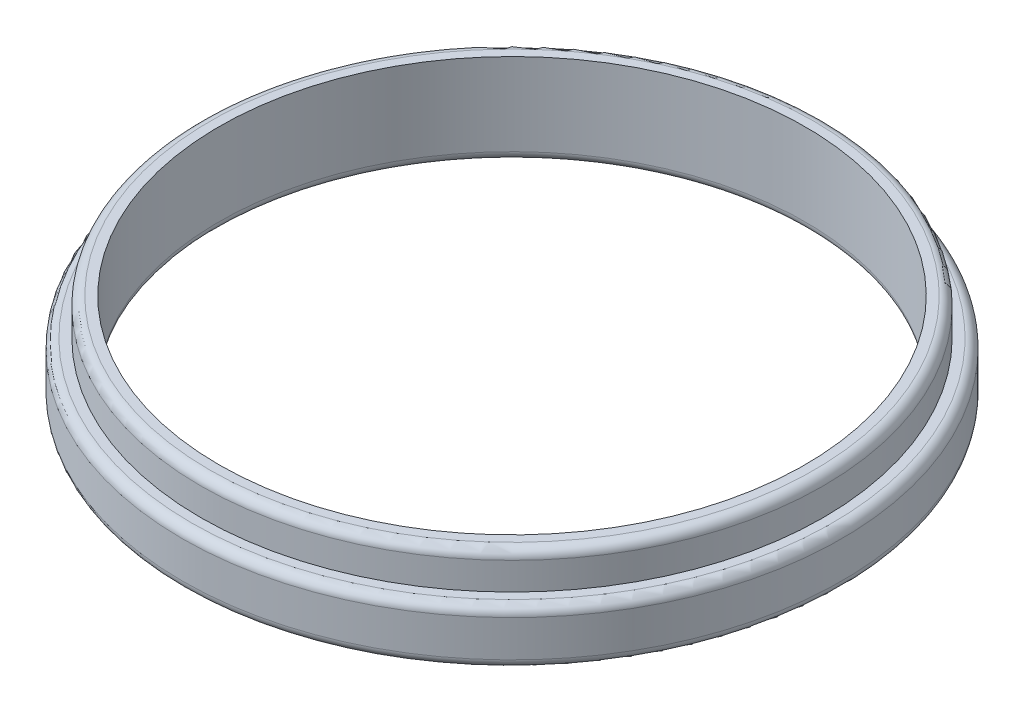
ISO-10303-21;
HEADER;
FILE_DESCRIPTION(('STEP AP214'),'2;1');
FILE_NAME('part.step','',(''),(''),'','','');
FILE_SCHEMA(('AUTOMOTIVE_DESIGN { 1 0 10303 214 1 1 1 1 }'));
ENDSEC;
DATA;
#1=APPLICATION_CONTEXT('core data for automotive mechanical design processes');
#2=APPLICATION_PROTOCOL_DEFINITION('international standard','automotive_design',2000,#1);
#3=PRODUCT_CONTEXT('',#1,'mechanical');
#4=PRODUCT('Part','Part','',(#3));
#5=PRODUCT_RELATED_PRODUCT_CATEGORY('part','',(#4));
#6=PRODUCT_DEFINITION_FORMATION('','',#4);
#7=PRODUCT_DEFINITION_CONTEXT('part definition',#1,'design');
#8=PRODUCT_DEFINITION('design','',#6,#7);
#9=PRODUCT_DEFINITION_SHAPE('','',#8);
#10=(LENGTH_UNIT() NAMED_UNIT(*) SI_UNIT(.MILLI.,.METRE.));
#11=(NAMED_UNIT(*) PLANE_ANGLE_UNIT() SI_UNIT($,.RADIAN.));
#12=(NAMED_UNIT(*) SI_UNIT($,.STERADIAN.) SOLID_ANGLE_UNIT());
#13=UNCERTAINTY_MEASURE_WITH_UNIT(LENGTH_MEASURE(1.E-05),#10,'distance_accuracy_value','');
#14=(GEOMETRIC_REPRESENTATION_CONTEXT(3) GLOBAL_UNCERTAINTY_ASSIGNED_CONTEXT((#13)) GLOBAL_UNIT_ASSIGNED_CONTEXT((#10,
#11,#12)) REPRESENTATION_CONTEXT('',''));
#15=CARTESIAN_POINT('',(0.,0.,0.));
#16=DIRECTION('',(0.,0.,1.));
#17=DIRECTION('',(1.,0.,0.));
#18=AXIS2_PLACEMENT_3D('',#15,#16,#17);
#19=CARTESIAN_POINT('',(0.,1.5,0.));
#20=DIRECTION('',(0.,-1.,0.));
#21=DIRECTION('',(0.,0.,-1.));
#22=AXIS2_PLACEMENT_3D('',#19,#20,#21);
#23=CYLINDRICAL_SURFACE('',#22,9.);
#24=CARTESIAN_POINT('',(0.,0.25,0.));
#25=DIRECTION('',(0.,1.,0.));
#26=DIRECTION('',(0.,0.,1.));
#27=AXIS2_PLACEMENT_3D('',#24,#25,#26);
#28=CIRCLE('',#27,9.);
#29=CARTESIAN_POINT('',(0.,0.25,9.));
#30=VERTEX_POINT('',#29);
#31=EDGE_CURVE('E47',#30,#30,#28,.T.);
#32=ORIENTED_EDGE('',*,*,#31,.T.);
#33=EDGE_LOOP('',(#32));
#34=FACE_BOUND('',#33,.T.);
#35=CARTESIAN_POINT('',(0.,1.25,0.));
#36=DIRECTION('',(0.,1.,0.));
#37=DIRECTION('',(0.,0.,1.));
#38=AXIS2_PLACEMENT_3D('',#35,#36,#37);
#39=CIRCLE('',#38,9.);
#40=CARTESIAN_POINT('',(0.,1.25,9.));
#41=VERTEX_POINT('',#40);
#42=EDGE_CURVE('E58',#41,#41,#39,.F.);
#43=ORIENTED_EDGE('',*,*,#42,.T.);
#44=EDGE_LOOP('',(#43));
#45=FACE_BOUND('',#44,.T.);
#46=ADVANCED_FACE('F32',(#34,#45),#23,.T.);
#47=CARTESIAN_POINT('',(0.,1.5,0.));
#48=DIRECTION('',(0.,1.,0.));
#49=DIRECTION('',(0.,0.,1.));
#50=AXIS2_PLACEMENT_3D('',#47,#48,#49);
#51=PLANE('',#50);
#52=CARTESIAN_POINT('',(0.,1.5,0.));
#53=DIRECTION('',(0.,1.,0.));
#54=DIRECTION('',(0.,0.,1.));
#55=AXIS2_PLACEMENT_3D('',#52,#53,#54);
#56=CIRCLE('',#55,8.75);
#57=CARTESIAN_POINT('',(0.,1.5,8.75));
#58=VERTEX_POINT('',#57);
#59=EDGE_CURVE('E61',#58,#58,#56,.T.);
#60=ORIENTED_EDGE('',*,*,#59,.T.);
#61=EDGE_LOOP('',(#60));
#62=FACE_BOUND('',#61,.T.);
#63=CARTESIAN_POINT('',(0.,1.5,0.));
#64=DIRECTION('',(0.,1.,0.));
#65=DIRECTION('',(0.,0.,1.));
#66=AXIS2_PLACEMENT_3D('',#63,#64,#65);
#67=CIRCLE('',#66,8.5);
#68=CARTESIAN_POINT('',(0.,1.5,8.5));
#69=VERTEX_POINT('',#68);
#70=EDGE_CURVE('E64',#69,#69,#67,.T.);
#71=ORIENTED_EDGE('',*,*,#70,.F.);
#72=EDGE_LOOP('',(#71));
#73=FACE_BOUND('',#72,.T.);
#74=ADVANCED_FACE('F88',(#62,#73),#51,.T.);
#75=CARTESIAN_POINT('',(0.,0.,0.));
#76=DIRECTION('',(0.,1.,0.));
#77=DIRECTION('',(0.,0.,1.));
#78=AXIS2_PLACEMENT_3D('',#75,#76,#77);
#79=PLANE('',#78);
#80=CARTESIAN_POINT('',(0.,0.,0.));
#81=DIRECTION('',(0.,1.,0.));
#82=DIRECTION('',(0.,0.,1.));
#83=AXIS2_PLACEMENT_3D('',#80,#81,#82);
#84=CIRCLE('',#83,8.25);
#85=CARTESIAN_POINT('',(0.,0.,8.25));
#86=VERTEX_POINT('',#85);
#87=EDGE_CURVE('E39',#86,#86,#84,.T.);
#88=ORIENTED_EDGE('',*,*,#87,.T.);
#89=EDGE_LOOP('',(#88));
#90=FACE_BOUND('',#89,.T.);
#91=CARTESIAN_POINT('',(0.,0.,0.));
#92=DIRECTION('',(0.,1.,0.));
#93=DIRECTION('',(0.,0.,1.));
#94=AXIS2_PLACEMENT_3D('',#91,#92,#93);
#95=CIRCLE('',#94,8.75);
#96=CARTESIAN_POINT('',(0.,0.,8.75));
#97=VERTEX_POINT('',#96);
#98=EDGE_CURVE('E43',#97,#97,#95,.F.);
#99=ORIENTED_EDGE('',*,*,#98,.T.);
#100=EDGE_LOOP('',(#99));
#101=FACE_BOUND('',#100,.T.);
#102=ADVANCED_FACE('F84',(#90,#101),#79,.F.);
#103=CARTESIAN_POINT('',(0.,2.5,0.));
#104=DIRECTION('',(0.,-1.,0.));
#105=DIRECTION('',(0.,0.,-1.));
#106=AXIS2_PLACEMENT_3D('',#103,#104,#105);
#107=CYLINDRICAL_SURFACE('',#106,8.5);
#108=CARTESIAN_POINT('',(0.,2.25,0.));
#109=DIRECTION('',(0.,1.,0.));
#110=DIRECTION('',(0.,0.,1.));
#111=AXIS2_PLACEMENT_3D('',#108,#109,#110);
#112=CIRCLE('',#111,8.5);
#113=CARTESIAN_POINT('',(0.,2.25,8.5));
#114=VERTEX_POINT('',#113);
#115=EDGE_CURVE('E52',#114,#114,#112,.F.);
#116=ORIENTED_EDGE('',*,*,#115,.T.);
#117=EDGE_LOOP('',(#116));
#118=FACE_BOUND('',#117,.T.);
#119=ORIENTED_EDGE('',*,*,#70,.T.);
#120=EDGE_LOOP('',(#119));
#121=FACE_BOUND('',#120,.T.);
#122=ADVANCED_FACE('F75',(#118,#121),#107,.T.);
#123=CARTESIAN_POINT('',(0.,2.5,0.));
#124=DIRECTION('',(0.,1.,0.));
#125=DIRECTION('',(0.,0.,1.));
#126=AXIS2_PLACEMENT_3D('',#123,#124,#125);
#127=PLANE('',#126);
#128=CARTESIAN_POINT('',(0.,2.5,0.));
#129=DIRECTION('',(0.,1.,0.));
#130=DIRECTION('',(0.,0.,1.));
#131=AXIS2_PLACEMENT_3D('',#128,#129,#130);
#132=CIRCLE('',#131,8.25);
#133=CARTESIAN_POINT('',(0.,2.5,8.25));
#134=VERTEX_POINT('',#133);
#135=EDGE_CURVE('E55',#134,#134,#132,.T.);
#136=ORIENTED_EDGE('',*,*,#135,.T.);
#137=EDGE_LOOP('',(#136));
#138=FACE_BOUND('',#137,.T.);
#139=CARTESIAN_POINT('',(0.,2.5,0.));
#140=DIRECTION('',(0.,1.,0.));
#141=DIRECTION('',(0.,0.,1.));
#142=AXIS2_PLACEMENT_3D('',#139,#140,#141);
#143=CIRCLE('',#142,8.);
#144=CARTESIAN_POINT('',(0.,2.5,8.));
#145=VERTEX_POINT('',#144);
#146=EDGE_CURVE('E67',#145,#145,#143,.T.);
#147=ORIENTED_EDGE('',*,*,#146,.F.);
#148=EDGE_LOOP('',(#147));
#149=FACE_BOUND('',#148,.T.);
#150=ADVANCED_FACE('F73',(#138,#149),#127,.T.);
#151=CARTESIAN_POINT('',(0.,1.5,0.));
#152=DIRECTION('',(0.,-1.,0.));
#153=DIRECTION('',(0.,0.,-1.));
#154=AXIS2_PLACEMENT_3D('',#151,#152,#153);
#155=CYLINDRICAL_SURFACE('',#154,8.);
#156=CARTESIAN_POINT('',(0.,0.25,0.));
#157=DIRECTION('',(0.,1.,0.));
#158=DIRECTION('',(0.,0.,1.));
#159=AXIS2_PLACEMENT_3D('',#156,#157,#158);
#160=CIRCLE('',#159,8.);
#161=CARTESIAN_POINT('',(0.,0.25,8.));
#162=VERTEX_POINT('',#161);
#163=EDGE_CURVE('E10',#162,#162,#160,.F.);
#164=ORIENTED_EDGE('',*,*,#163,.T.);
#165=EDGE_LOOP('',(#164));
#166=FACE_BOUND('',#165,.T.);
#167=ORIENTED_EDGE('',*,*,#146,.T.);
#168=EDGE_LOOP('',(#167));
#169=FACE_BOUND('',#168,.T.);
#170=ADVANCED_FACE('F71',(#166,#169),#155,.F.);
#171=CARTESIAN_POINT('',(0.,1.25,0.));
#172=DIRECTION('',(0.,1.,0.));
#173=DIRECTION('',(0.,0.,1.));
#174=AXIS2_PLACEMENT_3D('',#171,#172,#173);
#175=TOROIDAL_SURFACE('',#174,8.75,0.25);
#176=ORIENTED_EDGE('',*,*,#42,.F.);
#177=EDGE_LOOP('',(#176));
#178=FACE_BOUND('',#177,.T.);
#179=ORIENTED_EDGE('',*,*,#59,.F.);
#180=EDGE_LOOP('',(#179));
#181=FACE_BOUND('',#180,.T.);
#182=ADVANCED_FACE('F82',(#178,#181),#175,.T.);
#183=CARTESIAN_POINT('',(0.,2.25,0.));
#184=DIRECTION('',(0.,1.,0.));
#185=DIRECTION('',(0.,0.,1.));
#186=AXIS2_PLACEMENT_3D('',#183,#184,#185);
#187=TOROIDAL_SURFACE('',#186,8.25,0.25);
#188=ORIENTED_EDGE('',*,*,#115,.F.);
#189=EDGE_LOOP('',(#188));
#190=FACE_BOUND('',#189,.T.);
#191=ORIENTED_EDGE('',*,*,#135,.F.);
#192=EDGE_LOOP('',(#191));
#193=FACE_BOUND('',#192,.T.);
#194=ADVANCED_FACE('F101',(#190,#193),#187,.T.);
#195=CARTESIAN_POINT('',(0.,0.25,0.));
#196=DIRECTION('',(0.,1.,0.));
#197=DIRECTION('',(0.,0.,1.));
#198=AXIS2_PLACEMENT_3D('',#195,#196,#197);
#199=TOROIDAL_SURFACE('',#198,8.75,0.25);
#200=ORIENTED_EDGE('',*,*,#98,.F.);
#201=EDGE_LOOP('',(#200));
#202=FACE_BOUND('',#201,.T.);
#203=ORIENTED_EDGE('',*,*,#31,.F.);
#204=EDGE_LOOP('',(#203));
#205=FACE_BOUND('',#204,.T.);
#206=ADVANCED_FACE('F104',(#202,#205),#199,.T.);
#207=CARTESIAN_POINT('',(0.,0.25,0.));
#208=DIRECTION('',(0.,1.,0.));
#209=DIRECTION('',(0.,0.,1.));
#210=AXIS2_PLACEMENT_3D('',#207,#208,#209);
#211=TOROIDAL_SURFACE('',#210,8.25,0.25);
#212=ORIENTED_EDGE('',*,*,#163,.F.);
#213=EDGE_LOOP('',(#212));
#214=FACE_BOUND('',#213,.T.);
#215=ORIENTED_EDGE('',*,*,#87,.F.);
#216=EDGE_LOOP('',(#215));
#217=FACE_BOUND('',#216,.T.);
#218=ADVANCED_FACE('F34',(#214,#217),#211,.T.);
#219=CLOSED_SHELL('',(#46,#74,#102,#122,#150,#170,#182,#194,#206,#218));
#220=MANIFOLD_SOLID_BREP('B2',#219);
#221=ADVANCED_BREP_SHAPE_REPRESENTATION('',(#18,#220),#14);
#222=SHAPE_DEFINITION_REPRESENTATION(#9,#221);
ENDSEC;
END-ISO-10303-21;
